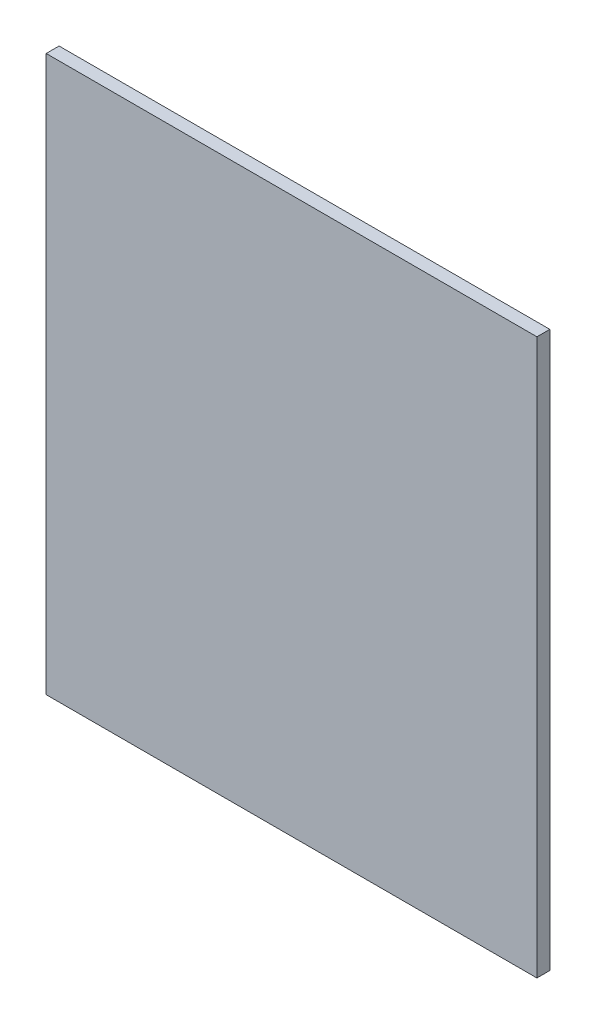
ISO-10303-21;
HEADER;
FILE_DESCRIPTION(('STEP AP214'),'2;1');
FILE_NAME('part.step','',(''),(''),'','','');
FILE_SCHEMA(('AUTOMOTIVE_DESIGN { 1 0 10303 214 1 1 1 1 }'));
ENDSEC;
DATA;
#1=APPLICATION_CONTEXT('core data for automotive mechanical design processes');
#2=APPLICATION_PROTOCOL_DEFINITION('international standard','automotive_design',2000,#1);
#3=PRODUCT_CONTEXT('',#1,'mechanical');
#4=PRODUCT('Part','Part','',(#3));
#5=PRODUCT_RELATED_PRODUCT_CATEGORY('part','',(#4));
#6=PRODUCT_DEFINITION_FORMATION('','',#4);
#7=PRODUCT_DEFINITION_CONTEXT('part definition',#1,'design');
#8=PRODUCT_DEFINITION('design','',#6,#7);
#9=PRODUCT_DEFINITION_SHAPE('','',#8);
#10=(LENGTH_UNIT() NAMED_UNIT(*) SI_UNIT(.MILLI.,.METRE.));
#11=(NAMED_UNIT(*) PLANE_ANGLE_UNIT() SI_UNIT($,.RADIAN.));
#12=(NAMED_UNIT(*) SI_UNIT($,.STERADIAN.) SOLID_ANGLE_UNIT());
#13=UNCERTAINTY_MEASURE_WITH_UNIT(LENGTH_MEASURE(1.E-05),#10,'distance_accuracy_value','');
#14=(GEOMETRIC_REPRESENTATION_CONTEXT(3) GLOBAL_UNCERTAINTY_ASSIGNED_CONTEXT((#13)) GLOBAL_UNIT_ASSIGNED_CONTEXT((#10,
#11,#12)) REPRESENTATION_CONTEXT('',''));
#15=CARTESIAN_POINT('',(0.,0.,0.));
#16=DIRECTION('',(0.,0.,1.));
#17=DIRECTION('',(1.,0.,0.));
#18=AXIS2_PLACEMENT_3D('',#15,#16,#17);
#19=CARTESIAN_POINT('',(-241.3,273.05,12.7));
#20=DIRECTION('',(0.,1.,0.));
#21=DIRECTION('',(0.,0.,1.));
#22=AXIS2_PLACEMENT_3D('',#19,#20,#21);
#23=PLANE('',#22);
#24=DIRECTION('',(1.,0.,0.));
#25=VECTOR('',#24,1.);
#26=CARTESIAN_POINT('',(-241.3,273.05,0.));
#27=LINE('',#26,#25);
#28=CARTESIAN_POINT('',(-241.3,273.05,0.));
#29=VERTEX_POINT('',#28);
#30=CARTESIAN_POINT('',(241.3,273.05,0.));
#31=VERTEX_POINT('',#30);
#32=EDGE_CURVE('E109',#29,#31,#27,.T.);
#33=ORIENTED_EDGE('',*,*,#32,.F.);
#34=DIRECTION('',(0.,0.,-1.));
#35=VECTOR('',#34,1.);
#36=CARTESIAN_POINT('',(-241.3,273.05,12.7));
#37=LINE('',#36,#35);
#38=CARTESIAN_POINT('',(-241.3,273.05,12.7));
#39=VERTEX_POINT('',#38);
#40=EDGE_CURVE('E11',#39,#29,#37,.T.);
#41=ORIENTED_EDGE('',*,*,#40,.F.);
#42=DIRECTION('',(1.,0.,0.));
#43=VECTOR('',#42,1.);
#44=CARTESIAN_POINT('',(-241.3,273.05,12.7));
#45=LINE('',#44,#43);
#46=CARTESIAN_POINT('',(241.3,273.05,12.7));
#47=VERTEX_POINT('',#46);
#48=EDGE_CURVE('E101',#39,#47,#45,.T.);
#49=ORIENTED_EDGE('',*,*,#48,.T.);
#50=DIRECTION('',(0.,0.,-1.));
#51=VECTOR('',#50,1.);
#52=CARTESIAN_POINT('',(241.3,273.05,12.7));
#53=LINE('',#52,#51);
#54=EDGE_CURVE('E42',#47,#31,#53,.T.);
#55=ORIENTED_EDGE('',*,*,#54,.T.);
#56=EDGE_LOOP('',(#33,#41,#49,#55));
#57=FACE_BOUND('',#56,.T.);
#58=ADVANCED_FACE('F39',(#57),#23,.T.);
#59=CARTESIAN_POINT('',(-241.3,-273.05,12.7));
#60=DIRECTION('',(-1.,0.,0.));
#61=DIRECTION('',(0.,0.,1.));
#62=AXIS2_PLACEMENT_3D('',#59,#60,#61);
#63=PLANE('',#62);
#64=DIRECTION('',(0.,1.,0.));
#65=VECTOR('',#64,1.);
#66=CARTESIAN_POINT('',(-241.3,-273.05,0.));
#67=LINE('',#66,#65);
#68=CARTESIAN_POINT('',(-241.3,-273.05,0.));
#69=VERTEX_POINT('',#68);
#70=EDGE_CURVE('E104',#69,#29,#67,.T.);
#71=ORIENTED_EDGE('',*,*,#70,.F.);
#72=DIRECTION('',(0.,0.,-1.));
#73=VECTOR('',#72,1.);
#74=CARTESIAN_POINT('',(-241.3,-273.05,12.7));
#75=LINE('',#74,#73);
#76=CARTESIAN_POINT('',(-241.3,-273.05,12.7));
#77=VERTEX_POINT('',#76);
#78=EDGE_CURVE('E49',#77,#69,#75,.T.);
#79=ORIENTED_EDGE('',*,*,#78,.F.);
#80=DIRECTION('',(0.,1.,0.));
#81=VECTOR('',#80,1.);
#82=CARTESIAN_POINT('',(-241.3,-273.05,12.7));
#83=LINE('',#82,#81);
#84=EDGE_CURVE('E88',#77,#39,#83,.T.);
#85=ORIENTED_EDGE('',*,*,#84,.T.);
#86=ORIENTED_EDGE('',*,*,#40,.T.);
#87=EDGE_LOOP('',(#71,#79,#85,#86));
#88=FACE_BOUND('',#87,.T.);
#89=ADVANCED_FACE('F125',(#88),#63,.T.);
#90=CARTESIAN_POINT('',(-241.3,-273.05,12.7));
#91=DIRECTION('',(0.,1.,0.));
#92=DIRECTION('',(0.,0.,1.));
#93=AXIS2_PLACEMENT_3D('',#90,#91,#92);
#94=PLANE('',#93);
#95=DIRECTION('',(1.,0.,0.));
#96=VECTOR('',#95,1.);
#97=CARTESIAN_POINT('',(-241.3,-273.05,0.));
#98=LINE('',#97,#96);
#99=CARTESIAN_POINT('',(241.3,-273.05,0.));
#100=VERTEX_POINT('',#99);
#101=EDGE_CURVE('E94',#69,#100,#98,.T.);
#102=ORIENTED_EDGE('',*,*,#101,.T.);
#103=DIRECTION('',(0.,0.,-1.));
#104=VECTOR('',#103,1.);
#105=CARTESIAN_POINT('',(241.3,-273.05,12.7));
#106=LINE('',#105,#104);
#107=CARTESIAN_POINT('',(241.3,-273.05,12.7));
#108=VERTEX_POINT('',#107);
#109=EDGE_CURVE('E92',#108,#100,#106,.T.);
#110=ORIENTED_EDGE('',*,*,#109,.F.);
#111=DIRECTION('',(1.,0.,0.));
#112=VECTOR('',#111,1.);
#113=CARTESIAN_POINT('',(-241.3,-273.05,12.7));
#114=LINE('',#113,#112);
#115=EDGE_CURVE('E85',#77,#108,#114,.T.);
#116=ORIENTED_EDGE('',*,*,#115,.F.);
#117=ORIENTED_EDGE('',*,*,#78,.T.);
#118=EDGE_LOOP('',(#102,#110,#116,#117));
#119=FACE_BOUND('',#118,.T.);
#120=ADVANCED_FACE('F93',(#119),#94,.F.);
#121=CARTESIAN_POINT('',(241.3,-273.05,12.7));
#122=DIRECTION('',(-1.,0.,0.));
#123=DIRECTION('',(0.,0.,1.));
#124=AXIS2_PLACEMENT_3D('',#121,#122,#123);
#125=PLANE('',#124);
#126=DIRECTION('',(0.,1.,0.));
#127=VECTOR('',#126,1.);
#128=CARTESIAN_POINT('',(241.3,-273.05,0.));
#129=LINE('',#128,#127);
#130=EDGE_CURVE('E113',#100,#31,#129,.T.);
#131=ORIENTED_EDGE('',*,*,#130,.T.);
#132=ORIENTED_EDGE('',*,*,#54,.F.);
#133=DIRECTION('',(0.,1.,0.));
#134=VECTOR('',#133,1.);
#135=CARTESIAN_POINT('',(241.3,-273.05,12.7));
#136=LINE('',#135,#134);
#137=EDGE_CURVE('E82',#108,#47,#136,.T.);
#138=ORIENTED_EDGE('',*,*,#137,.F.);
#139=ORIENTED_EDGE('',*,*,#109,.T.);
#140=EDGE_LOOP('',(#131,#132,#138,#139));
#141=FACE_BOUND('',#140,.T.);
#142=ADVANCED_FACE('F99',(#141),#125,.F.);
#143=CARTESIAN_POINT('',(0.,0.,12.7));
#144=DIRECTION('',(0.,0.,1.));
#145=DIRECTION('',(1.,0.,0.));
#146=AXIS2_PLACEMENT_3D('',#143,#144,#145);
#147=PLANE('',#146);
#148=ORIENTED_EDGE('',*,*,#48,.F.);
#149=ORIENTED_EDGE('',*,*,#84,.F.);
#150=ORIENTED_EDGE('',*,*,#115,.T.);
#151=ORIENTED_EDGE('',*,*,#137,.T.);
#152=EDGE_LOOP('',(#148,#149,#150,#151));
#153=FACE_BOUND('',#152,.T.);
#154=ADVANCED_FACE('F87',(#153),#147,.T.);
#155=CARTESIAN_POINT('',(0.,0.,0.));
#156=DIRECTION('',(0.,0.,1.));
#157=DIRECTION('',(1.,0.,0.));
#158=AXIS2_PLACEMENT_3D('',#155,#156,#157);
#159=PLANE('',#158);
#160=ORIENTED_EDGE('',*,*,#32,.T.);
#161=ORIENTED_EDGE('',*,*,#130,.F.);
#162=ORIENTED_EDGE('',*,*,#101,.F.);
#163=ORIENTED_EDGE('',*,*,#70,.T.);
#164=EDGE_LOOP('',(#160,#161,#162,#163));
#165=FACE_BOUND('',#164,.T.);
#166=ADVANCED_FACE('F124',(#165),#159,.F.);
#167=CLOSED_SHELL('',(#58,#89,#120,#142,#154,#166));
#168=MANIFOLD_SOLID_BREP('B2',#167);
#169=ADVANCED_BREP_SHAPE_REPRESENTATION('',(#18,#168),#14);
#170=SHAPE_DEFINITION_REPRESENTATION(#9,#169);
ENDSEC;
END-ISO-10303-21;
